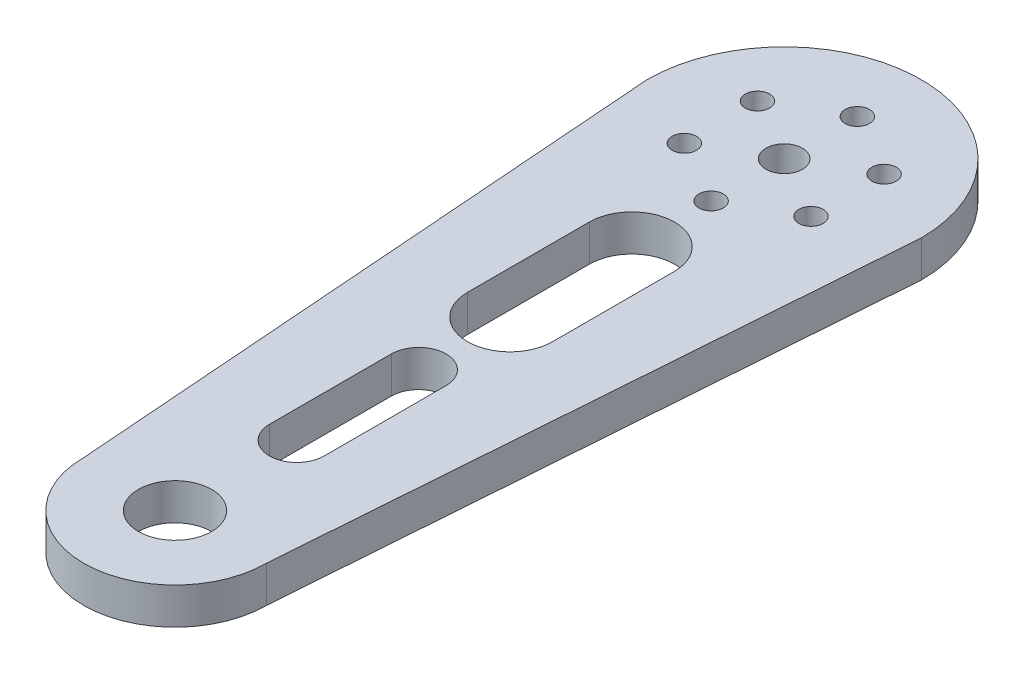
ISO-10303-21;
HEADER;
FILE_DESCRIPTION(('STEP AP214'),'2;1');
FILE_NAME('part.step','',(''),(''),'','','');
FILE_SCHEMA(('AUTOMOTIVE_DESIGN { 1 0 10303 214 1 1 1 1 }'));
ENDSEC;
DATA;
#1=APPLICATION_CONTEXT('core data for automotive mechanical design processes');
#2=APPLICATION_PROTOCOL_DEFINITION('international standard','automotive_design',2000,#1);
#3=PRODUCT_CONTEXT('',#1,'mechanical');
#4=PRODUCT('Part','Part','',(#3));
#5=PRODUCT_RELATED_PRODUCT_CATEGORY('part','',(#4));
#6=PRODUCT_DEFINITION_FORMATION('','',#4);
#7=PRODUCT_DEFINITION_CONTEXT('part definition',#1,'design');
#8=PRODUCT_DEFINITION('design','',#6,#7);
#9=PRODUCT_DEFINITION_SHAPE('','',#8);
#10=(LENGTH_UNIT() NAMED_UNIT(*) SI_UNIT(.MILLI.,.METRE.));
#11=(NAMED_UNIT(*) PLANE_ANGLE_UNIT() SI_UNIT($,.RADIAN.));
#12=(NAMED_UNIT(*) SI_UNIT($,.STERADIAN.) SOLID_ANGLE_UNIT());
#13=UNCERTAINTY_MEASURE_WITH_UNIT(LENGTH_MEASURE(1.E-05),#10,'distance_accuracy_value','');
#14=(GEOMETRIC_REPRESENTATION_CONTEXT(3) GLOBAL_UNCERTAINTY_ASSIGNED_CONTEXT((#13)) GLOBAL_UNIT_ASSIGNED_CONTEXT((#10,
#11,#12)) REPRESENTATION_CONTEXT('',''));
#15=CARTESIAN_POINT('',(0.,0.,0.));
#16=DIRECTION('',(0.,0.,1.));
#17=DIRECTION('',(1.,0.,0.));
#18=AXIS2_PLACEMENT_3D('',#15,#16,#17);
#19=CARTESIAN_POINT('',(0.,6.,100.));
#20=DIRECTION('',(0.,1.,0.));
#21=DIRECTION('',(0.,0.,1.));
#22=AXIS2_PLACEMENT_3D('',#19,#20,#21);
#23=PLANE('',#22);
#24=CARTESIAN_POINT('',(0.,6.,80.));
#25=DIRECTION('',(0.,1.,0.));
#26=DIRECTION('',(0.,0.,1.));
#27=AXIS2_PLACEMENT_3D('',#24,#25,#26);
#28=CIRCLE('',#27,4.5);
#29=CARTESIAN_POINT('',(-4.5,6.,80.));
#30=VERTEX_POINT('',#29);
#31=CARTESIAN_POINT('',(4.5,6.,80.));
#32=VERTEX_POINT('',#31);
#33=EDGE_CURVE('E55',#30,#32,#28,.T.);
#34=ORIENTED_EDGE('',*,*,#33,.F.);
#35=DIRECTION('',(0.,0.,1.));
#36=VECTOR('',#35,1.);
#37=CARTESIAN_POINT('',(-4.5,6.,80.));
#38=LINE('',#37,#36);
#39=CARTESIAN_POINT('',(-4.5,6.,60.));
#40=VERTEX_POINT('',#39);
#41=EDGE_CURVE('E152',#40,#30,#38,.T.);
#42=ORIENTED_EDGE('',*,*,#41,.F.);
#43=CARTESIAN_POINT('',(0.,6.,60.));
#44=DIRECTION('',(0.,1.,0.));
#45=DIRECTION('',(0.,0.,1.));
#46=AXIS2_PLACEMENT_3D('',#43,#44,#45);
#47=CIRCLE('',#46,4.5);
#48=CARTESIAN_POINT('',(4.5,6.,60.));
#49=VERTEX_POINT('',#48);
#50=EDGE_CURVE('E136',#49,#40,#47,.T.);
#51=ORIENTED_EDGE('',*,*,#50,.F.);
#52=DIRECTION('',(0.,0.,-1.));
#53=VECTOR('',#52,1.);
#54=CARTESIAN_POINT('',(4.5,6.,80.));
#55=LINE('',#54,#53);
#56=EDGE_CURVE('E146',#32,#49,#55,.T.);
#57=ORIENTED_EDGE('',*,*,#56,.F.);
#58=EDGE_LOOP('',(#34,#42,#51,#57));
#59=FACE_BOUND('',#58,.T.);
#60=CARTESIAN_POINT('',(0.,6.,45.));
#61=DIRECTION('',(0.,1.,0.));
#62=DIRECTION('',(0.,0.,1.));
#63=AXIS2_PLACEMENT_3D('',#60,#61,#62);
#64=CIRCLE('',#63,7.);
#65=CARTESIAN_POINT('',(-7.,6.,45.));
#66=VERTEX_POINT('',#65);
#67=CARTESIAN_POINT('',(7.,6.,45.));
#68=VERTEX_POINT('',#67);
#69=EDGE_CURVE('E63',#66,#68,#64,.T.);
#70=ORIENTED_EDGE('',*,*,#69,.F.);
#71=DIRECTION('',(0.,0.,1.));
#72=VECTOR('',#71,1.);
#73=CARTESIAN_POINT('',(-7.,6.,45.));
#74=LINE('',#73,#72);
#75=CARTESIAN_POINT('',(-7.,6.,25.));
#76=VERTEX_POINT('',#75);
#77=EDGE_CURVE('E164',#76,#66,#74,.T.);
#78=ORIENTED_EDGE('',*,*,#77,.F.);
#79=CARTESIAN_POINT('',(0.,6.,25.));
#80=DIRECTION('',(0.,1.,0.));
#81=DIRECTION('',(0.,0.,1.));
#82=AXIS2_PLACEMENT_3D('',#79,#80,#81);
#83=CIRCLE('',#82,7.);
#84=CARTESIAN_POINT('',(7.,6.,25.));
#85=VERTEX_POINT('',#84);
#86=EDGE_CURVE('E173',#85,#76,#83,.T.);
#87=ORIENTED_EDGE('',*,*,#86,.F.);
#88=DIRECTION('',(0.,0.,-1.));
#89=VECTOR('',#88,1.);
#90=CARTESIAN_POINT('',(7.,6.,45.));
#91=LINE('',#90,#89);
#92=EDGE_CURVE('E176',#68,#85,#91,.T.);
#93=ORIENTED_EDGE('',*,*,#92,.F.);
#94=EDGE_LOOP('',(#70,#78,#87,#93));
#95=FACE_BOUND('',#94,.T.);
#96=CARTESIAN_POINT('',(-10.3923048454129,6.,-5.9999999999994));
#97=DIRECTION('',(0.,1.,0.));
#98=DIRECTION('',(0.,0.,1.));
#99=AXIS2_PLACEMENT_3D('',#96,#97,#98);
#100=CIRCLE('',#99,2.00000000000064);
#101=CARTESIAN_POINT('',(-10.3923048454129,6.,-3.99999999999876));
#102=VERTEX_POINT('',#101);
#103=EDGE_CURVE('E186',#102,#102,#100,.T.);
#104=ORIENTED_EDGE('',*,*,#103,.F.);
#105=EDGE_LOOP('',(#104));
#106=FACE_BOUND('',#105,.T.);
#107=CARTESIAN_POINT('',(0.,6.,12.));
#108=DIRECTION('',(0.,1.,0.));
#109=DIRECTION('',(0.,0.,1.));
#110=AXIS2_PLACEMENT_3D('',#107,#108,#109);
#111=CIRCLE('',#110,2.00000000000008);
#112=CARTESIAN_POINT('',(0.,6.,14.0000000000001));
#113=VERTEX_POINT('',#112);
#114=EDGE_CURVE('E198',#113,#113,#111,.T.);
#115=ORIENTED_EDGE('',*,*,#114,.F.);
#116=EDGE_LOOP('',(#115));
#117=FACE_BOUND('',#116,.T.);
#118=CARTESIAN_POINT('',(10.3923048454136,6.,-6.00000000000059));
#119=DIRECTION('',(0.,1.,0.));
#120=DIRECTION('',(0.,0.,1.));
#121=AXIS2_PLACEMENT_3D('',#118,#119,#120);
#122=CIRCLE('',#121,2.00000000000019);
#123=CARTESIAN_POINT('',(10.3923048454136,6.,-4.00000000000041));
#124=VERTEX_POINT('',#123);
#125=EDGE_CURVE('E210',#124,#124,#122,.T.);
#126=ORIENTED_EDGE('',*,*,#125,.F.);
#127=EDGE_LOOP('',(#126));
#128=FACE_BOUND('',#127,.T.);
#129=CARTESIAN_POINT('',(0.,6.,-12.));
#130=DIRECTION('',(0.,1.,0.));
#131=DIRECTION('',(0.,0.,1.));
#132=AXIS2_PLACEMENT_3D('',#129,#130,#131);
#133=CIRCLE('',#132,2.);
#134=CARTESIAN_POINT('',(0.,6.,-10.));
#135=VERTEX_POINT('',#134);
#136=EDGE_CURVE('E222',#135,#135,#133,.T.);
#137=ORIENTED_EDGE('',*,*,#136,.F.);
#138=EDGE_LOOP('',(#137));
#139=FACE_BOUND('',#138,.T.);
#140=CARTESIAN_POINT('',(0.,6.,100.));
#141=DIRECTION('',(0.,1.,0.));
#142=DIRECTION('',(0.,0.,1.));
#143=AXIS2_PLACEMENT_3D('',#140,#141,#142);
#144=CIRCLE('',#143,15.);
#145=CARTESIAN_POINT('',(-15.,6.,100.));
#146=VERTEX_POINT('',#145);
#147=CARTESIAN_POINT('',(15.,6.,100.));
#148=VERTEX_POINT('',#147);
#149=EDGE_CURVE('E228',#146,#148,#144,.T.);
#150=ORIENTED_EDGE('',*,*,#149,.T.);
#151=DIRECTION('',(0.0747899482416343,0.,-0.997199309888456));
#152=VECTOR('',#151,1.);
#153=CARTESIAN_POINT('',(15.,6.,100.));
#154=LINE('',#153,#152);
#155=CARTESIAN_POINT('',(22.5,6.,0.));
#156=VERTEX_POINT('',#155);
#157=EDGE_CURVE('E231',#148,#156,#154,.T.);
#158=ORIENTED_EDGE('',*,*,#157,.T.);
#159=CARTESIAN_POINT('',(0.,6.,0.));
#160=DIRECTION('',(0.,1.,0.));
#161=DIRECTION('',(0.,0.,1.));
#162=AXIS2_PLACEMENT_3D('',#159,#160,#161);
#163=CIRCLE('',#162,22.5);
#164=CARTESIAN_POINT('',(-22.5,6.,0.));
#165=VERTEX_POINT('',#164);
#166=EDGE_CURVE('E234',#156,#165,#163,.T.);
#167=ORIENTED_EDGE('',*,*,#166,.T.);
#168=DIRECTION('',(0.0747899482416343,0.,0.997199309888456));
#169=VECTOR('',#168,1.);
#170=CARTESIAN_POINT('',(-15.,6.,100.));
#171=LINE('',#170,#169);
#172=EDGE_CURVE('E236',#165,#146,#171,.T.);
#173=ORIENTED_EDGE('',*,*,#172,.T.);
#174=EDGE_LOOP('',(#150,#158,#167,#173));
#175=FACE_BOUND('',#174,.T.);
#176=CARTESIAN_POINT('',(0.,6.,0.));
#177=DIRECTION('',(0.,1.,0.));
#178=DIRECTION('',(0.,0.,1.));
#179=AXIS2_PLACEMENT_3D('',#176,#177,#178);
#180=CIRCLE('',#179,3.);
#181=CARTESIAN_POINT('',(0.,6.,3.));
#182=VERTEX_POINT('',#181);
#183=EDGE_CURVE('E216',#182,#182,#180,.T.);
#184=ORIENTED_EDGE('',*,*,#183,.F.);
#185=EDGE_LOOP('',(#184));
#186=FACE_BOUND('',#185,.T.);
#187=CARTESIAN_POINT('',(10.3923048454143,6.,5.99999999999941));
#188=DIRECTION('',(0.,1.,0.));
#189=DIRECTION('',(0.,0.,1.));
#190=AXIS2_PLACEMENT_3D('',#187,#188,#189);
#191=CIRCLE('',#190,2.00000000000086);
#192=CARTESIAN_POINT('',(10.3923048454143,6.,8.00000000000027));
#193=VERTEX_POINT('',#192);
#194=EDGE_CURVE('E204',#193,#193,#191,.T.);
#195=ORIENTED_EDGE('',*,*,#194,.F.);
#196=EDGE_LOOP('',(#195));
#197=FACE_BOUND('',#196,.T.);
#198=CARTESIAN_POINT('',(-10.3923048454122,6.,6.00000000000059));
#199=DIRECTION('',(0.,1.,0.));
#200=DIRECTION('',(0.,0.,1.));
#201=AXIS2_PLACEMENT_3D('',#198,#199,#200);
#202=CIRCLE('',#201,2.00000000000126);
#203=CARTESIAN_POINT('',(-10.3923048454122,6.,8.00000000000185));
#204=VERTEX_POINT('',#203);
#205=EDGE_CURVE('E192',#204,#204,#202,.T.);
#206=ORIENTED_EDGE('',*,*,#205,.F.);
#207=EDGE_LOOP('',(#206));
#208=FACE_BOUND('',#207,.T.);
#209=CARTESIAN_POINT('',(0.,6.,100.));
#210=DIRECTION('',(0.,1.,0.));
#211=DIRECTION('',(0.,0.,1.));
#212=AXIS2_PLACEMENT_3D('',#209,#210,#211);
#213=CIRCLE('',#212,6.);
#214=CARTESIAN_POINT('',(0.,6.,106.));
#215=VERTEX_POINT('',#214);
#216=EDGE_CURVE('E180',#215,#215,#213,.T.);
#217=ORIENTED_EDGE('',*,*,#216,.F.);
#218=EDGE_LOOP('',(#217));
#219=FACE_BOUND('',#218,.T.);
#220=ADVANCED_FACE('F40',(#59,#95,#106,#117,#128,#139,#175,#186,#197,#208,#219),#23,.T.);
#221=CARTESIAN_POINT('',(0.,0.,100.));
#222=DIRECTION('',(0.,1.,0.));
#223=DIRECTION('',(0.,0.,1.));
#224=AXIS2_PLACEMENT_3D('',#221,#222,#223);
#225=PLANE('',#224);
#226=DIRECTION('',(0.,0.,1.));
#227=VECTOR('',#226,1.);
#228=CARTESIAN_POINT('',(-4.5,0.,100.));
#229=LINE('',#228,#227);
#230=CARTESIAN_POINT('',(-4.5,0.,60.));
#231=VERTEX_POINT('',#230);
#232=CARTESIAN_POINT('',(-4.5,0.,80.));
#233=VERTEX_POINT('',#232);
#234=EDGE_CURVE('E48',#231,#233,#229,.T.);
#235=ORIENTED_EDGE('',*,*,#234,.T.);
#236=CARTESIAN_POINT('',(0.,0.,80.));
#237=DIRECTION('',(0.,1.,0.));
#238=DIRECTION('',(0.,0.,1.));
#239=AXIS2_PLACEMENT_3D('',#236,#237,#238);
#240=CIRCLE('',#239,4.5);
#241=CARTESIAN_POINT('',(4.5,0.,80.));
#242=VERTEX_POINT('',#241);
#243=EDGE_CURVE('E11',#233,#242,#240,.T.);
#244=ORIENTED_EDGE('',*,*,#243,.T.);
#245=DIRECTION('',(0.,0.,-1.));
#246=VECTOR('',#245,1.);
#247=CARTESIAN_POINT('',(4.5,0.,100.));
#248=LINE('',#247,#246);
#249=CARTESIAN_POINT('',(4.5,0.,60.));
#250=VERTEX_POINT('',#249);
#251=EDGE_CURVE('E269',#242,#250,#248,.T.);
#252=ORIENTED_EDGE('',*,*,#251,.T.);
#253=CARTESIAN_POINT('',(0.,0.,60.));
#254=DIRECTION('',(0.,1.,0.));
#255=DIRECTION('',(0.,0.,1.));
#256=AXIS2_PLACEMENT_3D('',#253,#254,#255);
#257=CIRCLE('',#256,4.5);
#258=EDGE_CURVE('E139',#250,#231,#257,.T.);
#259=ORIENTED_EDGE('',*,*,#258,.T.);
#260=EDGE_LOOP('',(#235,#244,#252,#259));
#261=FACE_BOUND('',#260,.T.);
#262=DIRECTION('',(0.,0.,1.));
#263=VECTOR('',#262,1.);
#264=CARTESIAN_POINT('',(-7.,0.,100.));
#265=LINE('',#264,#263);
#266=CARTESIAN_POINT('',(-7.,0.,25.));
#267=VERTEX_POINT('',#266);
#268=CARTESIAN_POINT('',(-7.,0.,45.));
#269=VERTEX_POINT('',#268);
#270=EDGE_CURVE('E263',#267,#269,#265,.T.);
#271=ORIENTED_EDGE('',*,*,#270,.T.);
#272=CARTESIAN_POINT('',(0.,0.,45.));
#273=DIRECTION('',(0.,1.,0.));
#274=DIRECTION('',(0.,0.,1.));
#275=AXIS2_PLACEMENT_3D('',#272,#273,#274);
#276=CIRCLE('',#275,7.);
#277=CARTESIAN_POINT('',(7.,0.,45.));
#278=VERTEX_POINT('',#277);
#279=EDGE_CURVE('E266',#269,#278,#276,.T.);
#280=ORIENTED_EDGE('',*,*,#279,.T.);
#281=DIRECTION('',(0.,0.,-1.));
#282=VECTOR('',#281,1.);
#283=CARTESIAN_POINT('',(7.,0.,100.));
#284=LINE('',#283,#282);
#285=CARTESIAN_POINT('',(7.,0.,25.));
#286=VERTEX_POINT('',#285);
#287=EDGE_CURVE('E257',#278,#286,#284,.T.);
#288=ORIENTED_EDGE('',*,*,#287,.T.);
#289=CARTESIAN_POINT('',(0.,0.,25.));
#290=DIRECTION('',(0.,1.,0.));
#291=DIRECTION('',(0.,0.,1.));
#292=AXIS2_PLACEMENT_3D('',#289,#290,#291);
#293=CIRCLE('',#292,7.);
#294=EDGE_CURVE('E260',#286,#267,#293,.T.);
#295=ORIENTED_EDGE('',*,*,#294,.T.);
#296=EDGE_LOOP('',(#271,#280,#288,#295));
#297=FACE_BOUND('',#296,.T.);
#298=CARTESIAN_POINT('',(0.,0.,100.));
#299=DIRECTION('',(0.,1.,0.));
#300=DIRECTION('',(0.,0.,1.));
#301=AXIS2_PLACEMENT_3D('',#298,#299,#300);
#302=CIRCLE('',#301,15.);
#303=CARTESIAN_POINT('',(-15.,0.,100.));
#304=VERTEX_POINT('',#303);
#305=CARTESIAN_POINT('',(15.,0.,100.));
#306=VERTEX_POINT('',#305);
#307=EDGE_CURVE('E225',#304,#306,#302,.T.);
#308=ORIENTED_EDGE('',*,*,#307,.F.);
#309=DIRECTION('',(0.0747899482416343,0.,0.997199309888456));
#310=VECTOR('',#309,1.);
#311=CARTESIAN_POINT('',(-15.,0.,100.));
#312=LINE('',#311,#310);
#313=CARTESIAN_POINT('',(-22.5,0.,0.));
#314=VERTEX_POINT('',#313);
#315=EDGE_CURVE('E232',#314,#304,#312,.T.);
#316=ORIENTED_EDGE('',*,*,#315,.F.);
#317=CARTESIAN_POINT('',(0.,0.,0.));
#318=DIRECTION('',(0.,1.,0.));
#319=DIRECTION('',(0.,0.,1.));
#320=AXIS2_PLACEMENT_3D('',#317,#318,#319);
#321=CIRCLE('',#320,22.5);
#322=CARTESIAN_POINT('',(22.5,0.,0.));
#323=VERTEX_POINT('',#322);
#324=EDGE_CURVE('E243',#323,#314,#321,.T.);
#325=ORIENTED_EDGE('',*,*,#324,.F.);
#326=DIRECTION('',(0.0747899482416343,0.,-0.997199309888456));
#327=VECTOR('',#326,1.);
#328=CARTESIAN_POINT('',(15.,0.,100.));
#329=LINE('',#328,#327);
#330=EDGE_CURVE('E241',#306,#323,#329,.T.);
#331=ORIENTED_EDGE('',*,*,#330,.F.);
#332=EDGE_LOOP('',(#308,#316,#325,#331));
#333=FACE_BOUND('',#332,.T.);
#334=CARTESIAN_POINT('',(0.,0.,-12.));
#335=DIRECTION('',(0.,1.,0.));
#336=DIRECTION('',(0.,0.,1.));
#337=AXIS2_PLACEMENT_3D('',#334,#335,#336);
#338=CIRCLE('',#337,2.);
#339=CARTESIAN_POINT('',(0.,0.,-10.));
#340=VERTEX_POINT('',#339);
#341=EDGE_CURVE('E219',#340,#340,#338,.T.);
#342=ORIENTED_EDGE('',*,*,#341,.T.);
#343=EDGE_LOOP('',(#342));
#344=FACE_BOUND('',#343,.T.);
#345=CARTESIAN_POINT('',(0.,0.,0.));
#346=DIRECTION('',(0.,1.,0.));
#347=DIRECTION('',(0.,0.,1.));
#348=AXIS2_PLACEMENT_3D('',#345,#346,#347);
#349=CIRCLE('',#348,3.);
#350=CARTESIAN_POINT('',(0.,0.,3.));
#351=VERTEX_POINT('',#350);
#352=EDGE_CURVE('E213',#351,#351,#349,.T.);
#353=ORIENTED_EDGE('',*,*,#352,.T.);
#354=EDGE_LOOP('',(#353));
#355=FACE_BOUND('',#354,.T.);
#356=CARTESIAN_POINT('',(10.3923048454136,0.,-6.00000000000059));
#357=DIRECTION('',(0.,1.,0.));
#358=DIRECTION('',(0.,0.,1.));
#359=AXIS2_PLACEMENT_3D('',#356,#357,#358);
#360=CIRCLE('',#359,2.00000000000019);
#361=CARTESIAN_POINT('',(10.3923048454136,0.,-4.00000000000041));
#362=VERTEX_POINT('',#361);
#363=EDGE_CURVE('E207',#362,#362,#360,.T.);
#364=ORIENTED_EDGE('',*,*,#363,.T.);
#365=EDGE_LOOP('',(#364));
#366=FACE_BOUND('',#365,.T.);
#367=CARTESIAN_POINT('',(10.3923048454143,0.,5.99999999999941));
#368=DIRECTION('',(0.,1.,0.));
#369=DIRECTION('',(0.,0.,1.));
#370=AXIS2_PLACEMENT_3D('',#367,#368,#369);
#371=CIRCLE('',#370,2.00000000000086);
#372=CARTESIAN_POINT('',(10.3923048454143,0.,8.00000000000027));
#373=VERTEX_POINT('',#372);
#374=EDGE_CURVE('E201',#373,#373,#371,.T.);
#375=ORIENTED_EDGE('',*,*,#374,.T.);
#376=EDGE_LOOP('',(#375));
#377=FACE_BOUND('',#376,.T.);
#378=CARTESIAN_POINT('',(0.,0.,12.));
#379=DIRECTION('',(0.,1.,0.));
#380=DIRECTION('',(0.,0.,1.));
#381=AXIS2_PLACEMENT_3D('',#378,#379,#380);
#382=CIRCLE('',#381,2.00000000000008);
#383=CARTESIAN_POINT('',(0.,0.,14.0000000000001));
#384=VERTEX_POINT('',#383);
#385=EDGE_CURVE('E195',#384,#384,#382,.T.);
#386=ORIENTED_EDGE('',*,*,#385,.T.);
#387=EDGE_LOOP('',(#386));
#388=FACE_BOUND('',#387,.T.);
#389=CARTESIAN_POINT('',(-10.3923048454122,0.,6.00000000000059));
#390=DIRECTION('',(0.,1.,0.));
#391=DIRECTION('',(0.,0.,1.));
#392=AXIS2_PLACEMENT_3D('',#389,#390,#391);
#393=CIRCLE('',#392,2.00000000000126);
#394=CARTESIAN_POINT('',(-10.3923048454122,0.,8.00000000000185));
#395=VERTEX_POINT('',#394);
#396=EDGE_CURVE('E189',#395,#395,#393,.T.);
#397=ORIENTED_EDGE('',*,*,#396,.T.);
#398=EDGE_LOOP('',(#397));
#399=FACE_BOUND('',#398,.T.);
#400=CARTESIAN_POINT('',(-10.3923048454129,0.,-5.9999999999994));
#401=DIRECTION('',(0.,1.,0.));
#402=DIRECTION('',(0.,0.,1.));
#403=AXIS2_PLACEMENT_3D('',#400,#401,#402);
#404=CIRCLE('',#403,2.00000000000064);
#405=CARTESIAN_POINT('',(-10.3923048454129,0.,-3.99999999999876));
#406=VERTEX_POINT('',#405);
#407=EDGE_CURVE('E183',#406,#406,#404,.T.);
#408=ORIENTED_EDGE('',*,*,#407,.T.);
#409=EDGE_LOOP('',(#408));
#410=FACE_BOUND('',#409,.T.);
#411=CARTESIAN_POINT('',(0.,0.,100.));
#412=DIRECTION('',(0.,1.,0.));
#413=DIRECTION('',(0.,0.,1.));
#414=AXIS2_PLACEMENT_3D('',#411,#412,#413);
#415=CIRCLE('',#414,6.);
#416=CARTESIAN_POINT('',(0.,0.,106.));
#417=VERTEX_POINT('',#416);
#418=EDGE_CURVE('E159',#417,#417,#415,.T.);
#419=ORIENTED_EDGE('',*,*,#418,.T.);
#420=EDGE_LOOP('',(#419));
#421=FACE_BOUND('',#420,.T.);
#422=ADVANCED_FACE('F273',(#261,#297,#333,#344,#355,#366,#377,#388,#399,#410,#421),#225,.F.);
#423=CARTESIAN_POINT('',(0.,6.,100.));
#424=DIRECTION('',(0.,-1.,0.));
#425=DIRECTION('',(0.,0.,-1.));
#426=AXIS2_PLACEMENT_3D('',#423,#424,#425);
#427=CYLINDRICAL_SURFACE('',#426,15.);
#428=ORIENTED_EDGE('',*,*,#307,.T.);
#429=DIRECTION('',(0.,-1.,0.));
#430=VECTOR('',#429,1.);
#431=CARTESIAN_POINT('',(15.,6.,100.));
#432=LINE('',#431,#430);
#433=EDGE_CURVE('E254',#148,#306,#432,.T.);
#434=ORIENTED_EDGE('',*,*,#433,.F.);
#435=ORIENTED_EDGE('',*,*,#149,.F.);
#436=DIRECTION('',(0.,-1.,0.));
#437=VECTOR('',#436,1.);
#438=CARTESIAN_POINT('',(-15.,6.,100.));
#439=LINE('',#438,#437);
#440=EDGE_CURVE('E238',#146,#304,#439,.T.);
#441=ORIENTED_EDGE('',*,*,#440,.T.);
#442=EDGE_LOOP('',(#428,#434,#435,#441));
#443=FACE_BOUND('',#442,.T.);
#444=ADVANCED_FACE('F42',(#443),#427,.T.);
#445=CARTESIAN_POINT('',(15.,6.,100.));
#446=DIRECTION('',(-0.997199309888456,0.,-0.0747899482416343));
#447=DIRECTION('',(-0.0747899482416343,0.,0.997199309888456));
#448=AXIS2_PLACEMENT_3D('',#445,#446,#447);
#449=PLANE('',#448);
#450=ORIENTED_EDGE('',*,*,#330,.T.);
#451=DIRECTION('',(0.,-1.,0.));
#452=VECTOR('',#451,1.);
#453=CARTESIAN_POINT('',(22.5,6.,0.));
#454=LINE('',#453,#452);
#455=EDGE_CURVE('E251',#156,#323,#454,.T.);
#456=ORIENTED_EDGE('',*,*,#455,.F.);
#457=ORIENTED_EDGE('',*,*,#157,.F.);
#458=ORIENTED_EDGE('',*,*,#433,.T.);
#459=EDGE_LOOP('',(#450,#456,#457,#458));
#460=FACE_BOUND('',#459,.T.);
#461=ADVANCED_FACE('F308',(#460),#449,.F.);
#462=CARTESIAN_POINT('',(0.,6.,0.));
#463=DIRECTION('',(0.,-1.,0.));
#464=DIRECTION('',(0.,0.,-1.));
#465=AXIS2_PLACEMENT_3D('',#462,#463,#464);
#466=CYLINDRICAL_SURFACE('',#465,22.5);
#467=ORIENTED_EDGE('',*,*,#324,.T.);
#468=DIRECTION('',(0.,-1.,0.));
#469=VECTOR('',#468,1.);
#470=CARTESIAN_POINT('',(-22.5,6.,0.));
#471=LINE('',#470,#469);
#472=EDGE_CURVE('E248',#165,#314,#471,.T.);
#473=ORIENTED_EDGE('',*,*,#472,.F.);
#474=ORIENTED_EDGE('',*,*,#166,.F.);
#475=ORIENTED_EDGE('',*,*,#455,.T.);
#476=EDGE_LOOP('',(#467,#473,#474,#475));
#477=FACE_BOUND('',#476,.T.);
#478=ADVANCED_FACE('F305',(#477),#466,.T.);
#479=CARTESIAN_POINT('',(-15.,6.,100.));
#480=DIRECTION('',(0.997199309888456,0.,-0.0747899482416343));
#481=DIRECTION('',(-0.0747899482416343,0.,-0.997199309888456));
#482=AXIS2_PLACEMENT_3D('',#479,#480,#481);
#483=PLANE('',#482);
#484=ORIENTED_EDGE('',*,*,#315,.T.);
#485=ORIENTED_EDGE('',*,*,#440,.F.);
#486=ORIENTED_EDGE('',*,*,#172,.F.);
#487=ORIENTED_EDGE('',*,*,#472,.T.);
#488=EDGE_LOOP('',(#484,#485,#486,#487));
#489=FACE_BOUND('',#488,.T.);
#490=ADVANCED_FACE('F302',(#489),#483,.F.);
#491=CARTESIAN_POINT('',(0.,6.,-12.));
#492=DIRECTION('',(0.,-1.,0.));
#493=DIRECTION('',(0.,0.,-1.));
#494=AXIS2_PLACEMENT_3D('',#491,#492,#493);
#495=CYLINDRICAL_SURFACE('',#494,2.);
#496=ORIENTED_EDGE('',*,*,#136,.T.);
#497=EDGE_LOOP('',(#496));
#498=FACE_BOUND('',#497,.T.);
#499=ORIENTED_EDGE('',*,*,#341,.F.);
#500=EDGE_LOOP('',(#499));
#501=FACE_BOUND('',#500,.T.);
#502=ADVANCED_FACE('F299',(#498,#501),#495,.F.);
#503=CARTESIAN_POINT('',(0.,6.,0.));
#504=DIRECTION('',(0.,-1.,0.));
#505=DIRECTION('',(0.,0.,-1.));
#506=AXIS2_PLACEMENT_3D('',#503,#504,#505);
#507=CYLINDRICAL_SURFACE('',#506,3.);
#508=ORIENTED_EDGE('',*,*,#183,.T.);
#509=EDGE_LOOP('',(#508));
#510=FACE_BOUND('',#509,.T.);
#511=ORIENTED_EDGE('',*,*,#352,.F.);
#512=EDGE_LOOP('',(#511));
#513=FACE_BOUND('',#512,.T.);
#514=ADVANCED_FACE('F370',(#510,#513),#507,.F.);
#515=CARTESIAN_POINT('',(10.3923048454136,6.,-6.00000000000059));
#516=DIRECTION('',(0.,-1.,0.));
#517=DIRECTION('',(0.,0.,-1.));
#518=AXIS2_PLACEMENT_3D('',#515,#516,#517);
#519=CYLINDRICAL_SURFACE('',#518,2.00000000000019);
#520=ORIENTED_EDGE('',*,*,#125,.T.);
#521=EDGE_LOOP('',(#520));
#522=FACE_BOUND('',#521,.T.);
#523=ORIENTED_EDGE('',*,*,#363,.F.);
#524=EDGE_LOOP('',(#523));
#525=FACE_BOUND('',#524,.T.);
#526=ADVANCED_FACE('F367',(#522,#525),#519,.F.);
#527=CARTESIAN_POINT('',(10.3923048454143,6.,5.99999999999941));
#528=DIRECTION('',(0.,-1.,0.));
#529=DIRECTION('',(0.,0.,-1.));
#530=AXIS2_PLACEMENT_3D('',#527,#528,#529);
#531=CYLINDRICAL_SURFACE('',#530,2.00000000000086);
#532=ORIENTED_EDGE('',*,*,#194,.T.);
#533=EDGE_LOOP('',(#532));
#534=FACE_BOUND('',#533,.T.);
#535=ORIENTED_EDGE('',*,*,#374,.F.);
#536=EDGE_LOOP('',(#535));
#537=FACE_BOUND('',#536,.T.);
#538=ADVANCED_FACE('F363',(#534,#537),#531,.F.);
#539=CARTESIAN_POINT('',(0.,6.,12.));
#540=DIRECTION('',(0.,-1.,0.));
#541=DIRECTION('',(0.,0.,-1.));
#542=AXIS2_PLACEMENT_3D('',#539,#540,#541);
#543=CYLINDRICAL_SURFACE('',#542,2.00000000000008);
#544=ORIENTED_EDGE('',*,*,#114,.T.);
#545=EDGE_LOOP('',(#544));
#546=FACE_BOUND('',#545,.T.);
#547=ORIENTED_EDGE('',*,*,#385,.F.);
#548=EDGE_LOOP('',(#547));
#549=FACE_BOUND('',#548,.T.);
#550=ADVANCED_FACE('F359',(#546,#549),#543,.F.);
#551=CARTESIAN_POINT('',(-10.3923048454122,6.,6.00000000000059));
#552=DIRECTION('',(0.,-1.,0.));
#553=DIRECTION('',(0.,0.,-1.));
#554=AXIS2_PLACEMENT_3D('',#551,#552,#553);
#555=CYLINDRICAL_SURFACE('',#554,2.00000000000126);
#556=ORIENTED_EDGE('',*,*,#205,.T.);
#557=EDGE_LOOP('',(#556));
#558=FACE_BOUND('',#557,.T.);
#559=ORIENTED_EDGE('',*,*,#396,.F.);
#560=EDGE_LOOP('',(#559));
#561=FACE_BOUND('',#560,.T.);
#562=ADVANCED_FACE('F351',(#558,#561),#555,.F.);
#563=CARTESIAN_POINT('',(-10.3923048454129,6.,-5.9999999999994));
#564=DIRECTION('',(0.,-1.,0.));
#565=DIRECTION('',(0.,0.,-1.));
#566=AXIS2_PLACEMENT_3D('',#563,#564,#565);
#567=CYLINDRICAL_SURFACE('',#566,2.00000000000064);
#568=ORIENTED_EDGE('',*,*,#103,.T.);
#569=EDGE_LOOP('',(#568));
#570=FACE_BOUND('',#569,.T.);
#571=ORIENTED_EDGE('',*,*,#407,.F.);
#572=EDGE_LOOP('',(#571));
#573=FACE_BOUND('',#572,.T.);
#574=ADVANCED_FACE('F342',(#570,#573),#567,.F.);
#575=CARTESIAN_POINT('',(0.,6.,100.));
#576=DIRECTION('',(0.,-1.,0.));
#577=DIRECTION('',(0.,0.,-1.));
#578=AXIS2_PLACEMENT_3D('',#575,#576,#577);
#579=CYLINDRICAL_SURFACE('',#578,6.);
#580=ORIENTED_EDGE('',*,*,#216,.T.);
#581=EDGE_LOOP('',(#580));
#582=FACE_BOUND('',#581,.T.);
#583=ORIENTED_EDGE('',*,*,#418,.F.);
#584=EDGE_LOOP('',(#583));
#585=FACE_BOUND('',#584,.T.);
#586=ADVANCED_FACE('F338',(#582,#585),#579,.F.);
#587=CARTESIAN_POINT('',(0.,-4.,45.));
#588=DIRECTION('',(0.,1.,0.));
#589=DIRECTION('',(0.,0.,1.));
#590=AXIS2_PLACEMENT_3D('',#587,#588,#589);
#591=CYLINDRICAL_SURFACE('',#590,7.);
#592=DIRECTION('',(0.,1.,0.));
#593=VECTOR('',#592,1.);
#594=CARTESIAN_POINT('',(-7.,-4.,45.));
#595=LINE('',#594,#593);
#596=EDGE_CURVE('E169',#269,#66,#595,.T.);
#597=ORIENTED_EDGE('',*,*,#596,.T.);
#598=ORIENTED_EDGE('',*,*,#69,.T.);
#599=DIRECTION('',(0.,1.,0.));
#600=VECTOR('',#599,1.);
#601=CARTESIAN_POINT('',(7.,-4.,45.));
#602=LINE('',#601,#600);
#603=EDGE_CURVE('E162',#278,#68,#602,.T.);
#604=ORIENTED_EDGE('',*,*,#603,.F.);
#605=ORIENTED_EDGE('',*,*,#279,.F.);
#606=EDGE_LOOP('',(#597,#598,#604,#605));
#607=FACE_BOUND('',#606,.T.);
#608=ADVANCED_FACE('F341',(#607),#591,.F.);
#609=CARTESIAN_POINT('',(-7.,-4.,45.));
#610=DIRECTION('',(-1.,0.,0.));
#611=DIRECTION('',(0.,0.,1.));
#612=AXIS2_PLACEMENT_3D('',#609,#610,#611);
#613=PLANE('',#612);
#614=DIRECTION('',(0.,1.,0.));
#615=VECTOR('',#614,1.);
#616=CARTESIAN_POINT('',(-7.,-4.,25.));
#617=LINE('',#616,#615);
#618=EDGE_CURVE('E167',#267,#76,#617,.T.);
#619=ORIENTED_EDGE('',*,*,#618,.T.);
#620=ORIENTED_EDGE('',*,*,#77,.T.);
#621=ORIENTED_EDGE('',*,*,#596,.F.);
#622=ORIENTED_EDGE('',*,*,#270,.F.);
#623=EDGE_LOOP('',(#619,#620,#621,#622));
#624=FACE_BOUND('',#623,.T.);
#625=ADVANCED_FACE('F350',(#624),#613,.F.);
#626=CARTESIAN_POINT('',(0.,-4.,25.));
#627=DIRECTION('',(0.,1.,0.));
#628=DIRECTION('',(0.,0.,1.));
#629=AXIS2_PLACEMENT_3D('',#626,#627,#628);
#630=CYLINDRICAL_SURFACE('',#629,7.);
#631=DIRECTION('',(0.,1.,0.));
#632=VECTOR('',#631,1.);
#633=CARTESIAN_POINT('',(7.,-4.,25.));
#634=LINE('',#633,#632);
#635=EDGE_CURVE('E165',#286,#85,#634,.T.);
#636=ORIENTED_EDGE('',*,*,#635,.T.);
#637=ORIENTED_EDGE('',*,*,#86,.T.);
#638=ORIENTED_EDGE('',*,*,#618,.F.);
#639=ORIENTED_EDGE('',*,*,#294,.F.);
#640=EDGE_LOOP('',(#636,#637,#638,#639));
#641=FACE_BOUND('',#640,.T.);
#642=ADVANCED_FACE('F287',(#641),#630,.F.);
#643=CARTESIAN_POINT('',(7.,-4.,45.));
#644=DIRECTION('',(1.,0.,0.));
#645=DIRECTION('',(0.,0.,-1.));
#646=AXIS2_PLACEMENT_3D('',#643,#644,#645);
#647=PLANE('',#646);
#648=ORIENTED_EDGE('',*,*,#603,.T.);
#649=ORIENTED_EDGE('',*,*,#92,.T.);
#650=ORIENTED_EDGE('',*,*,#635,.F.);
#651=ORIENTED_EDGE('',*,*,#287,.F.);
#652=EDGE_LOOP('',(#648,#649,#650,#651));
#653=FACE_BOUND('',#652,.T.);
#654=ADVANCED_FACE('F280',(#653),#647,.F.);
#655=CARTESIAN_POINT('',(0.,-4.,80.));
#656=DIRECTION('',(0.,1.,0.));
#657=DIRECTION('',(0.,0.,1.));
#658=AXIS2_PLACEMENT_3D('',#655,#656,#657);
#659=CYLINDRICAL_SURFACE('',#658,4.5);
#660=DIRECTION('',(0.,1.,0.));
#661=VECTOR('',#660,1.);
#662=CARTESIAN_POINT('',(-4.5,-4.,80.));
#663=LINE('',#662,#661);
#664=EDGE_CURVE('E157',#233,#30,#663,.T.);
#665=ORIENTED_EDGE('',*,*,#664,.T.);
#666=ORIENTED_EDGE('',*,*,#33,.T.);
#667=DIRECTION('',(0.,1.,0.));
#668=VECTOR('',#667,1.);
#669=CARTESIAN_POINT('',(4.5,-4.,80.));
#670=LINE('',#669,#668);
#671=EDGE_CURVE('E143',#242,#32,#670,.T.);
#672=ORIENTED_EDGE('',*,*,#671,.F.);
#673=ORIENTED_EDGE('',*,*,#243,.F.);
#674=EDGE_LOOP('',(#665,#666,#672,#673));
#675=FACE_BOUND('',#674,.T.);
#676=ADVANCED_FACE('F278',(#675),#659,.F.);
#677=CARTESIAN_POINT('',(-4.5,-4.,80.));
#678=DIRECTION('',(-1.,0.,0.));
#679=DIRECTION('',(0.,0.,1.));
#680=AXIS2_PLACEMENT_3D('',#677,#678,#679);
#681=PLANE('',#680);
#682=DIRECTION('',(0.,1.,0.));
#683=VECTOR('',#682,1.);
#684=CARTESIAN_POINT('',(-4.5,-4.,60.));
#685=LINE('',#684,#683);
#686=EDGE_CURVE('E142',#231,#40,#685,.T.);
#687=ORIENTED_EDGE('',*,*,#686,.T.);
#688=ORIENTED_EDGE('',*,*,#41,.T.);
#689=ORIENTED_EDGE('',*,*,#664,.F.);
#690=ORIENTED_EDGE('',*,*,#234,.F.);
#691=EDGE_LOOP('',(#687,#688,#689,#690));
#692=FACE_BOUND('',#691,.T.);
#693=ADVANCED_FACE('F277',(#692),#681,.F.);
#694=CARTESIAN_POINT('',(0.,-4.,60.));
#695=DIRECTION('',(0.,1.,0.));
#696=DIRECTION('',(0.,0.,1.));
#697=AXIS2_PLACEMENT_3D('',#694,#695,#696);
#698=CYLINDRICAL_SURFACE('',#697,4.5);
#699=DIRECTION('',(0.,1.,0.));
#700=VECTOR('',#699,1.);
#701=CARTESIAN_POINT('',(4.5,-4.,60.));
#702=LINE('',#701,#700);
#703=EDGE_CURVE('E131',#250,#49,#702,.T.);
#704=ORIENTED_EDGE('',*,*,#703,.T.);
#705=ORIENTED_EDGE('',*,*,#50,.T.);
#706=ORIENTED_EDGE('',*,*,#686,.F.);
#707=ORIENTED_EDGE('',*,*,#258,.F.);
#708=EDGE_LOOP('',(#704,#705,#706,#707));
#709=FACE_BOUND('',#708,.T.);
#710=ADVANCED_FACE('F133',(#709),#698,.F.);
#711=CARTESIAN_POINT('',(4.5,-4.,80.));
#712=DIRECTION('',(1.,0.,0.));
#713=DIRECTION('',(0.,0.,-1.));
#714=AXIS2_PLACEMENT_3D('',#711,#712,#713);
#715=PLANE('',#714);
#716=ORIENTED_EDGE('',*,*,#671,.T.);
#717=ORIENTED_EDGE('',*,*,#56,.T.);
#718=ORIENTED_EDGE('',*,*,#703,.F.);
#719=ORIENTED_EDGE('',*,*,#251,.F.);
#720=EDGE_LOOP('',(#716,#717,#718,#719));
#721=FACE_BOUND('',#720,.T.);
#722=ADVANCED_FACE('F147',(#721),#715,.F.);
#723=CLOSED_SHELL('',(#220,#422,#444,#461,#478,#490,#502,#514,#526,#538,#550,#562,#574,#586,
#608,#625,#642,#654,#676,#693,#710,#722));
#724=MANIFOLD_SOLID_BREP('B2',#723);
#725=ADVANCED_BREP_SHAPE_REPRESENTATION('',(#18,#724),#14);
#726=SHAPE_DEFINITION_REPRESENTATION(#9,#725);
ENDSEC;
END-ISO-10303-21;
